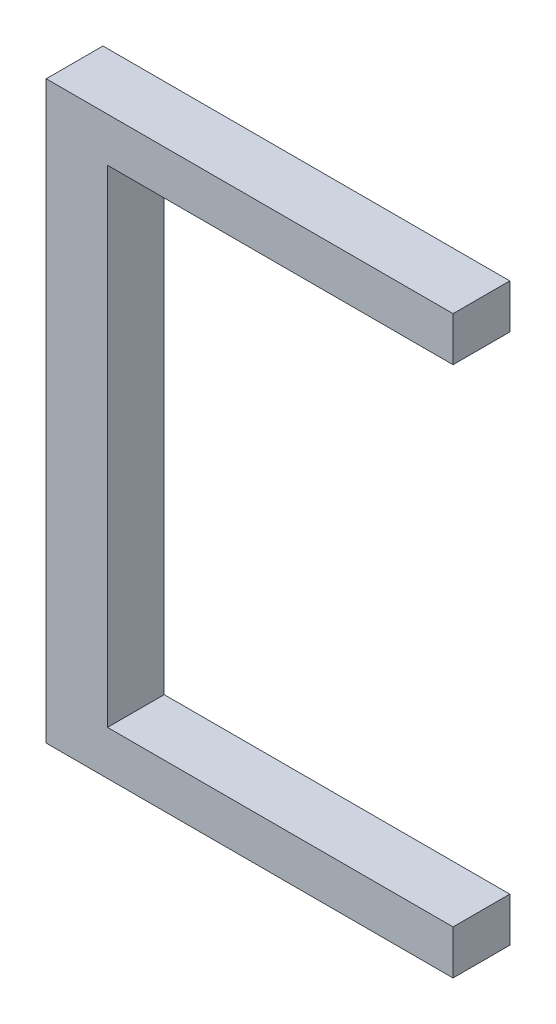
ISO-10303-21;
HEADER;
FILE_DESCRIPTION(('STEP AP214'),'2;1');
FILE_NAME('part.step','',(''),(''),'','','');
FILE_SCHEMA(('AUTOMOTIVE_DESIGN { 1 0 10303 214 1 1 1 1 }'));
ENDSEC;
DATA;
#1=APPLICATION_CONTEXT('core data for automotive mechanical design processes');
#2=APPLICATION_PROTOCOL_DEFINITION('international standard','automotive_design',2000,#1);
#3=PRODUCT_CONTEXT('',#1,'mechanical');
#4=PRODUCT('Part','Part','',(#3));
#5=PRODUCT_RELATED_PRODUCT_CATEGORY('part','',(#4));
#6=PRODUCT_DEFINITION_FORMATION('','',#4);
#7=PRODUCT_DEFINITION_CONTEXT('part definition',#1,'design');
#8=PRODUCT_DEFINITION('design','',#6,#7);
#9=PRODUCT_DEFINITION_SHAPE('','',#8);
#10=(LENGTH_UNIT() NAMED_UNIT(*) SI_UNIT(.MILLI.,.METRE.));
#11=(NAMED_UNIT(*) PLANE_ANGLE_UNIT() SI_UNIT($,.RADIAN.));
#12=(NAMED_UNIT(*) SI_UNIT($,.STERADIAN.) SOLID_ANGLE_UNIT());
#13=UNCERTAINTY_MEASURE_WITH_UNIT(LENGTH_MEASURE(1.E-05),#10,'distance_accuracy_value','');
#14=(GEOMETRIC_REPRESENTATION_CONTEXT(3) GLOBAL_UNCERTAINTY_ASSIGNED_CONTEXT((#13)) GLOBAL_UNIT_ASSIGNED_CONTEXT((#10,
#11,#12)) REPRESENTATION_CONTEXT('',''));
#15=CARTESIAN_POINT('',(0.,0.,0.));
#16=DIRECTION('',(0.,0.,1.));
#17=DIRECTION('',(1.,0.,0.));
#18=AXIS2_PLACEMENT_3D('',#15,#16,#17);
#19=CARTESIAN_POINT('',(10.8,42.9,10.));
#20=DIRECTION('',(-1.,0.,0.));
#21=DIRECTION('',(0.,0.,1.));
#22=AXIS2_PLACEMENT_3D('',#19,#20,#21);
#23=PLANE('',#22);
#24=DIRECTION('',(0.,1.,0.));
#25=VECTOR('',#24,1.);
#26=CARTESIAN_POINT('',(10.8,42.9,0.));
#27=LINE('',#26,#25);
#28=CARTESIAN_POINT('',(10.8,-42.9,0.));
#29=VERTEX_POINT('',#28);
#30=CARTESIAN_POINT('',(10.8,42.9,0.));
#31=VERTEX_POINT('',#30);
#32=EDGE_CURVE('E129',#29,#31,#27,.T.);
#33=ORIENTED_EDGE('',*,*,#32,.T.);
#34=DIRECTION('',(0.,0.,-1.));
#35=VECTOR('',#34,1.);
#36=CARTESIAN_POINT('',(10.8,42.9,10.));
#37=LINE('',#36,#35);
#38=CARTESIAN_POINT('',(10.8,42.9,10.));
#39=VERTEX_POINT('',#38);
#40=EDGE_CURVE('E11',#39,#31,#37,.T.);
#41=ORIENTED_EDGE('',*,*,#40,.F.);
#42=DIRECTION('',(0.,1.,0.));
#43=VECTOR('',#42,1.);
#44=CARTESIAN_POINT('',(10.8,42.9,10.));
#45=LINE('',#44,#43);
#46=CARTESIAN_POINT('',(10.8,-42.9,10.));
#47=VERTEX_POINT('',#46);
#48=EDGE_CURVE('E143',#47,#39,#45,.T.);
#49=ORIENTED_EDGE('',*,*,#48,.F.);
#50=DIRECTION('',(0.,0.,-1.));
#51=VECTOR('',#50,1.);
#52=CARTESIAN_POINT('',(10.8,-42.9,10.));
#53=LINE('',#52,#51);
#54=EDGE_CURVE('E125',#47,#29,#53,.T.);
#55=ORIENTED_EDGE('',*,*,#54,.T.);
#56=EDGE_LOOP('',(#33,#41,#49,#55));
#57=FACE_BOUND('',#56,.T.);
#58=ADVANCED_FACE('F33',(#57),#23,.F.);
#59=CARTESIAN_POINT('',(71.7,42.9,10.));
#60=DIRECTION('',(0.,1.,0.));
#61=DIRECTION('',(-1.,0.,0.));
#62=AXIS2_PLACEMENT_3D('',#59,#60,#61);
#63=PLANE('',#62);
#64=DIRECTION('',(1.,0.,0.));
#65=VECTOR('',#64,1.);
#66=CARTESIAN_POINT('',(71.7,42.9,0.));
#67=LINE('',#66,#65);
#68=CARTESIAN_POINT('',(71.7,42.9,0.));
#69=VERTEX_POINT('',#68);
#70=EDGE_CURVE('E132',#31,#69,#67,.T.);
#71=ORIENTED_EDGE('',*,*,#70,.T.);
#72=DIRECTION('',(0.,0.,-1.));
#73=VECTOR('',#72,1.);
#74=CARTESIAN_POINT('',(71.7,42.9,10.));
#75=LINE('',#74,#73);
#76=CARTESIAN_POINT('',(71.7,42.9,10.));
#77=VERTEX_POINT('',#76);
#78=EDGE_CURVE('E41',#77,#69,#75,.T.);
#79=ORIENTED_EDGE('',*,*,#78,.F.);
#80=DIRECTION('',(1.,0.,0.));
#81=VECTOR('',#80,1.);
#82=CARTESIAN_POINT('',(71.7,42.9,10.));
#83=LINE('',#82,#81);
#84=EDGE_CURVE('E92',#39,#77,#83,.T.);
#85=ORIENTED_EDGE('',*,*,#84,.F.);
#86=ORIENTED_EDGE('',*,*,#40,.T.);
#87=EDGE_LOOP('',(#71,#79,#85,#86));
#88=FACE_BOUND('',#87,.T.);
#89=ADVANCED_FACE('F178',(#88),#63,.F.);
#90=CARTESIAN_POINT('',(71.7,50.7,10.));
#91=DIRECTION('',(-1.,0.,0.));
#92=DIRECTION('',(0.,0.,1.));
#93=AXIS2_PLACEMENT_3D('',#90,#91,#92);
#94=PLANE('',#93);
#95=DIRECTION('',(0.,1.,0.));
#96=VECTOR('',#95,1.);
#97=CARTESIAN_POINT('',(71.7,50.7,0.));
#98=LINE('',#97,#96);
#99=CARTESIAN_POINT('',(71.7,50.7,0.));
#100=VERTEX_POINT('',#99);
#101=EDGE_CURVE('E134',#69,#100,#98,.T.);
#102=ORIENTED_EDGE('',*,*,#101,.T.);
#103=DIRECTION('',(0.,0.,-1.));
#104=VECTOR('',#103,1.);
#105=CARTESIAN_POINT('',(71.7,50.7,10.));
#106=LINE('',#105,#104);
#107=CARTESIAN_POINT('',(71.7,50.7,10.));
#108=VERTEX_POINT('',#107);
#109=EDGE_CURVE('E150',#108,#100,#106,.T.);
#110=ORIENTED_EDGE('',*,*,#109,.F.);
#111=DIRECTION('',(0.,1.,0.));
#112=VECTOR('',#111,1.);
#113=CARTESIAN_POINT('',(71.7,50.7,10.));
#114=LINE('',#113,#112);
#115=EDGE_CURVE('E158',#77,#108,#114,.T.);
#116=ORIENTED_EDGE('',*,*,#115,.F.);
#117=ORIENTED_EDGE('',*,*,#78,.T.);
#118=EDGE_LOOP('',(#102,#110,#116,#117));
#119=FACE_BOUND('',#118,.T.);
#120=ADVANCED_FACE('F156',(#119),#94,.F.);
#121=CARTESIAN_POINT('',(0.,50.7,10.));
#122=DIRECTION('',(0.,-1.,0.));
#123=DIRECTION('',(0.,0.,-1.));
#124=AXIS2_PLACEMENT_3D('',#121,#122,#123);
#125=PLANE('',#124);
#126=DIRECTION('',(-1.,0.,0.));
#127=VECTOR('',#126,1.);
#128=CARTESIAN_POINT('',(0.,50.7,0.));
#129=LINE('',#128,#127);
#130=CARTESIAN_POINT('',(0.,50.7,0.));
#131=VERTEX_POINT('',#130);
#132=EDGE_CURVE('E136',#100,#131,#129,.T.);
#133=ORIENTED_EDGE('',*,*,#132,.T.);
#134=DIRECTION('',(0.,0.,-1.));
#135=VECTOR('',#134,1.);
#136=CARTESIAN_POINT('',(0.,50.7,10.));
#137=LINE('',#136,#135);
#138=CARTESIAN_POINT('',(0.,50.7,10.));
#139=VERTEX_POINT('',#138);
#140=EDGE_CURVE('E147',#139,#131,#137,.T.);
#141=ORIENTED_EDGE('',*,*,#140,.F.);
#142=DIRECTION('',(-1.,0.,0.));
#143=VECTOR('',#142,1.);
#144=CARTESIAN_POINT('',(0.,50.7,10.));
#145=LINE('',#144,#143);
#146=EDGE_CURVE('E170',#108,#139,#145,.T.);
#147=ORIENTED_EDGE('',*,*,#146,.F.);
#148=ORIENTED_EDGE('',*,*,#109,.T.);
#149=EDGE_LOOP('',(#133,#141,#147,#148));
#150=FACE_BOUND('',#149,.T.);
#151=ADVANCED_FACE('F166',(#150),#125,.F.);
#152=CARTESIAN_POINT('',(0.,-50.7,10.));
#153=DIRECTION('',(1.,0.,0.));
#154=DIRECTION('',(0.,0.,-1.));
#155=AXIS2_PLACEMENT_3D('',#152,#153,#154);
#156=PLANE('',#155);
#157=DIRECTION('',(0.,-1.,0.));
#158=VECTOR('',#157,1.);
#159=CARTESIAN_POINT('',(0.,-50.7,0.));
#160=LINE('',#159,#158);
#161=CARTESIAN_POINT('',(0.,-50.7,0.));
#162=VERTEX_POINT('',#161);
#163=EDGE_CURVE('E138',#131,#162,#160,.T.);
#164=ORIENTED_EDGE('',*,*,#163,.T.);
#165=DIRECTION('',(0.,0.,-1.));
#166=VECTOR('',#165,1.);
#167=CARTESIAN_POINT('',(0.,-50.7,10.));
#168=LINE('',#167,#166);
#169=CARTESIAN_POINT('',(0.,-50.7,10.));
#170=VERTEX_POINT('',#169);
#171=EDGE_CURVE('E120',#170,#162,#168,.T.);
#172=ORIENTED_EDGE('',*,*,#171,.F.);
#173=DIRECTION('',(0.,-1.,0.));
#174=VECTOR('',#173,1.);
#175=CARTESIAN_POINT('',(0.,-50.7,10.));
#176=LINE('',#175,#174);
#177=EDGE_CURVE('E111',#139,#170,#176,.T.);
#178=ORIENTED_EDGE('',*,*,#177,.F.);
#179=ORIENTED_EDGE('',*,*,#140,.T.);
#180=EDGE_LOOP('',(#164,#172,#178,#179));
#181=FACE_BOUND('',#180,.T.);
#182=ADVANCED_FACE('F169',(#181),#156,.F.);
#183=CARTESIAN_POINT('',(0.,-50.7,10.));
#184=DIRECTION('',(0.,1.,0.));
#185=DIRECTION('',(0.,0.,1.));
#186=AXIS2_PLACEMENT_3D('',#183,#184,#185);
#187=PLANE('',#186);
#188=DIRECTION('',(1.,0.,0.));
#189=VECTOR('',#188,1.);
#190=CARTESIAN_POINT('',(0.,-50.7,0.));
#191=LINE('',#190,#189);
#192=CARTESIAN_POINT('',(71.7,-50.7,0.));
#193=VERTEX_POINT('',#192);
#194=EDGE_CURVE('E119',#162,#193,#191,.T.);
#195=ORIENTED_EDGE('',*,*,#194,.T.);
#196=DIRECTION('',(0.,0.,-1.));
#197=VECTOR('',#196,1.);
#198=CARTESIAN_POINT('',(71.7,-50.7,10.));
#199=LINE('',#198,#197);
#200=CARTESIAN_POINT('',(71.7,-50.7,10.));
#201=VERTEX_POINT('',#200);
#202=EDGE_CURVE('E116',#201,#193,#199,.T.);
#203=ORIENTED_EDGE('',*,*,#202,.F.);
#204=DIRECTION('',(1.,0.,0.));
#205=VECTOR('',#204,1.);
#206=CARTESIAN_POINT('',(0.,-50.7,10.));
#207=LINE('',#206,#205);
#208=EDGE_CURVE('E105',#170,#201,#207,.T.);
#209=ORIENTED_EDGE('',*,*,#208,.F.);
#210=ORIENTED_EDGE('',*,*,#171,.T.);
#211=EDGE_LOOP('',(#195,#203,#209,#210));
#212=FACE_BOUND('',#211,.T.);
#213=ADVANCED_FACE('F117',(#212),#187,.F.);
#214=CARTESIAN_POINT('',(71.7,-42.9,10.));
#215=DIRECTION('',(-1.,0.,0.));
#216=DIRECTION('',(0.,-1.,0.));
#217=AXIS2_PLACEMENT_3D('',#214,#215,#216);
#218=PLANE('',#217);
#219=DIRECTION('',(0.,1.,0.));
#220=VECTOR('',#219,1.);
#221=CARTESIAN_POINT('',(71.7,-42.9,0.));
#222=LINE('',#221,#220);
#223=CARTESIAN_POINT('',(71.7,-42.9,0.));
#224=VERTEX_POINT('',#223);
#225=EDGE_CURVE('E78',#193,#224,#222,.T.);
#226=ORIENTED_EDGE('',*,*,#225,.T.);
#227=DIRECTION('',(0.,0.,-1.));
#228=VECTOR('',#227,1.);
#229=CARTESIAN_POINT('',(71.7,-42.9,10.));
#230=LINE('',#229,#228);
#231=CARTESIAN_POINT('',(71.7,-42.9,10.));
#232=VERTEX_POINT('',#231);
#233=EDGE_CURVE('E121',#232,#224,#230,.T.);
#234=ORIENTED_EDGE('',*,*,#233,.F.);
#235=DIRECTION('',(0.,1.,0.));
#236=VECTOR('',#235,1.);
#237=CARTESIAN_POINT('',(71.7,-42.9,10.));
#238=LINE('',#237,#236);
#239=EDGE_CURVE('E109',#201,#232,#238,.T.);
#240=ORIENTED_EDGE('',*,*,#239,.F.);
#241=ORIENTED_EDGE('',*,*,#202,.T.);
#242=EDGE_LOOP('',(#226,#234,#240,#241));
#243=FACE_BOUND('',#242,.T.);
#244=ADVANCED_FACE('F123',(#243),#218,.F.);
#245=CARTESIAN_POINT('',(10.8,-42.9,10.));
#246=DIRECTION('',(0.,-1.,0.));
#247=DIRECTION('',(0.,0.,-1.));
#248=AXIS2_PLACEMENT_3D('',#245,#246,#247);
#249=PLANE('',#248);
#250=DIRECTION('',(-1.,0.,0.));
#251=VECTOR('',#250,1.);
#252=CARTESIAN_POINT('',(10.8,-42.9,0.));
#253=LINE('',#252,#251);
#254=EDGE_CURVE('E84',#224,#29,#253,.T.);
#255=ORIENTED_EDGE('',*,*,#254,.T.);
#256=ORIENTED_EDGE('',*,*,#54,.F.);
#257=DIRECTION('',(-1.,0.,0.));
#258=VECTOR('',#257,1.);
#259=CARTESIAN_POINT('',(10.8,-42.9,10.));
#260=LINE('',#259,#258);
#261=EDGE_CURVE('E49',#232,#47,#260,.T.);
#262=ORIENTED_EDGE('',*,*,#261,.F.);
#263=ORIENTED_EDGE('',*,*,#233,.T.);
#264=EDGE_LOOP('',(#255,#256,#262,#263));
#265=FACE_BOUND('',#264,.T.);
#266=ADVANCED_FACE('F194',(#265),#249,.F.);
#267=CARTESIAN_POINT('',(0.,0.,10.));
#268=DIRECTION('',(0.,0.,1.));
#269=DIRECTION('',(1.,0.,0.));
#270=AXIS2_PLACEMENT_3D('',#267,#268,#269);
#271=PLANE('',#270);
#272=ORIENTED_EDGE('',*,*,#48,.T.);
#273=ORIENTED_EDGE('',*,*,#84,.T.);
#274=ORIENTED_EDGE('',*,*,#115,.T.);
#275=ORIENTED_EDGE('',*,*,#146,.T.);
#276=ORIENTED_EDGE('',*,*,#177,.T.);
#277=ORIENTED_EDGE('',*,*,#208,.T.);
#278=ORIENTED_EDGE('',*,*,#239,.T.);
#279=ORIENTED_EDGE('',*,*,#261,.T.);
#280=EDGE_LOOP('',(#272,#273,#274,#275,#276,#277,#278,#279));
#281=FACE_BOUND('',#280,.T.);
#282=ADVANCED_FACE('F107',(#281),#271,.T.);
#283=CARTESIAN_POINT('',(0.,0.,0.));
#284=DIRECTION('',(0.,0.,1.));
#285=DIRECTION('',(1.,0.,0.));
#286=AXIS2_PLACEMENT_3D('',#283,#284,#285);
#287=PLANE('',#286);
#288=ORIENTED_EDGE('',*,*,#32,.F.);
#289=ORIENTED_EDGE('',*,*,#254,.F.);
#290=ORIENTED_EDGE('',*,*,#225,.F.);
#291=ORIENTED_EDGE('',*,*,#194,.F.);
#292=ORIENTED_EDGE('',*,*,#163,.F.);
#293=ORIENTED_EDGE('',*,*,#132,.F.);
#294=ORIENTED_EDGE('',*,*,#101,.F.);
#295=ORIENTED_EDGE('',*,*,#70,.F.);
#296=EDGE_LOOP('',(#288,#289,#290,#291,#292,#293,#294,#295));
#297=FACE_BOUND('',#296,.T.);
#298=ADVANCED_FACE('F162',(#297),#287,.F.);
#299=CLOSED_SHELL('',(#58,#89,#120,#151,#182,#213,#244,#266,#282,#298));
#300=MANIFOLD_SOLID_BREP('B2',#299);
#301=ADVANCED_BREP_SHAPE_REPRESENTATION('',(#18,#300),#14);
#302=SHAPE_DEFINITION_REPRESENTATION(#9,#301);
ENDSEC;
END-ISO-10303-21;
